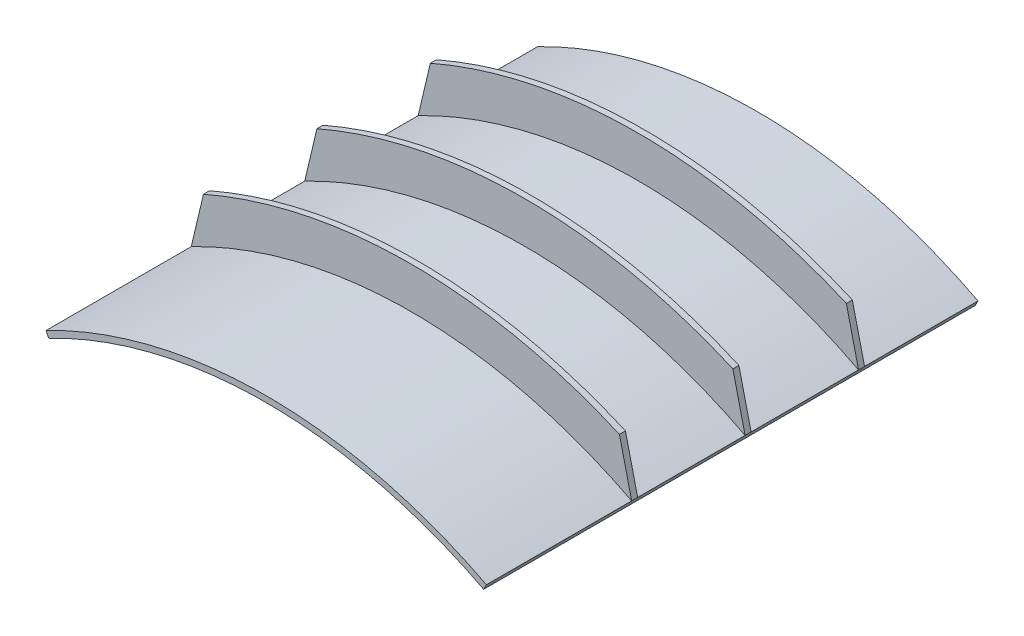
ISO-10303-21;
HEADER;
FILE_DESCRIPTION(('STEP AP214'),'2;1');
FILE_NAME('part.step','',(''),(''),'','','');
FILE_SCHEMA(('AUTOMOTIVE_DESIGN { 1 0 10303 214 1 1 1 1 }'));
ENDSEC;
DATA;
#1=APPLICATION_CONTEXT('core data for automotive mechanical design processes');
#2=APPLICATION_PROTOCOL_DEFINITION('international standard','automotive_design',2000,#1);
#3=PRODUCT_CONTEXT('',#1,'mechanical');
#4=PRODUCT('Part','Part','',(#3));
#5=PRODUCT_RELATED_PRODUCT_CATEGORY('part','',(#4));
#6=PRODUCT_DEFINITION_FORMATION('','',#4);
#7=PRODUCT_DEFINITION_CONTEXT('part definition',#1,'design');
#8=PRODUCT_DEFINITION('design','',#6,#7);
#9=PRODUCT_DEFINITION_SHAPE('','',#8);
#10=(LENGTH_UNIT() NAMED_UNIT(*) SI_UNIT(.MILLI.,.METRE.));
#11=(NAMED_UNIT(*) PLANE_ANGLE_UNIT() SI_UNIT($,.RADIAN.));
#12=(NAMED_UNIT(*) SI_UNIT($,.STERADIAN.) SOLID_ANGLE_UNIT());
#13=UNCERTAINTY_MEASURE_WITH_UNIT(LENGTH_MEASURE(1.E-05),#10,'distance_accuracy_value','');
#14=(GEOMETRIC_REPRESENTATION_CONTEXT(3) GLOBAL_UNCERTAINTY_ASSIGNED_CONTEXT((#13)) GLOBAL_UNIT_ASSIGNED_CONTEXT((#10,
#11,#12)) REPRESENTATION_CONTEXT('',''));
#15=CARTESIAN_POINT('',(0.,0.,0.));
#16=DIRECTION('',(0.,0.,1.));
#17=DIRECTION('',(1.,0.,0.));
#18=AXIS2_PLACEMENT_3D('',#15,#16,#17);
#19=CARTESIAN_POINT('',(0.,0.,260.));
#20=DIRECTION('',(0.,0.,-1.));
#21=DIRECTION('',(-1.,0.,0.));
#22=AXIS2_PLACEMENT_3D('',#19,#20,#21);
#23=CYLINDRICAL_SURFACE('',#22,253.175);
#24=CARTESIAN_POINT('',(0.,0.,183.175));
#25=DIRECTION('',(0.,0.,-1.));
#26=DIRECTION('',(-1.,0.,0.));
#27=AXIS2_PLACEMENT_3D('',#24,#25,#26);
#28=CIRCLE('',#27,253.175);
#29=CARTESIAN_POINT('',(-116.4605,224.798871360045,183.175));
#30=VERTEX_POINT('',#29);
#31=CARTESIAN_POINT('',(116.4605,224.798871360045,183.175));
#32=VERTEX_POINT('',#31);
#33=EDGE_CURVE('E56',#30,#32,#28,.T.);
#34=ORIENTED_EDGE('',*,*,#33,.F.);
#35=DIRECTION('',(0.,0.,-1.));
#36=VECTOR('',#35,1.);
#37=CARTESIAN_POINT('',(-116.4605,224.798871360045,260.));
#38=LINE('',#37,#36);
#39=CARTESIAN_POINT('',(-116.4605,224.798871360045,260.));
#40=VERTEX_POINT('',#39);
#41=EDGE_CURVE('E11',#40,#30,#38,.T.);
#42=ORIENTED_EDGE('',*,*,#41,.F.);
#43=CARTESIAN_POINT('',(0.,0.,260.));
#44=DIRECTION('',(0.,0.,1.));
#45=DIRECTION('',(-1.,0.,0.));
#46=AXIS2_PLACEMENT_3D('',#43,#44,#45);
#47=CIRCLE('',#46,253.175);
#48=CARTESIAN_POINT('',(116.4605,224.798871360045,260.));
#49=VERTEX_POINT('',#48);
#50=EDGE_CURVE('E252',#49,#40,#47,.T.);
#51=ORIENTED_EDGE('',*,*,#50,.F.);
#52=DIRECTION('',(0.,0.,-1.));
#53=VECTOR('',#52,1.);
#54=CARTESIAN_POINT('',(116.4605,224.798871360045,260.));
#55=LINE('',#54,#53);
#56=EDGE_CURVE('E271',#49,#32,#55,.T.);
#57=ORIENTED_EDGE('',*,*,#56,.T.);
#58=EDGE_LOOP('',(#34,#42,#51,#57));
#59=FACE_BOUND('',#58,.T.);
#60=ADVANCED_FACE('F33',(#59),#23,.T.);
#61=CARTESIAN_POINT('',(-116.4605,224.798871360045,180.));
#62=VERTEX_POINT('',#61);
#63=CARTESIAN_POINT('',(-116.4605,224.798871360045,123.175));
#64=VERTEX_POINT('',#63);
#65=EDGE_CURVE('E41',#62,#64,#38,.T.);
#66=ORIENTED_EDGE('',*,*,#65,.F.);
#67=CARTESIAN_POINT('',(0.,0.,180.));
#68=DIRECTION('',(0.,0.,-1.));
#69=DIRECTION('',(-1.,0.,0.));
#70=AXIS2_PLACEMENT_3D('',#67,#68,#69);
#71=CIRCLE('',#70,253.175);
#72=CARTESIAN_POINT('',(116.4605,224.798871360045,180.));
#73=VERTEX_POINT('',#72);
#74=EDGE_CURVE('E176',#62,#73,#71,.T.);
#75=ORIENTED_EDGE('',*,*,#74,.T.);
#76=CARTESIAN_POINT('',(116.4605,224.798871360045,123.175));
#77=VERTEX_POINT('',#76);
#78=EDGE_CURVE('E274',#73,#77,#55,.T.);
#79=ORIENTED_EDGE('',*,*,#78,.T.);
#80=CARTESIAN_POINT('',(0.,0.,123.175));
#81=DIRECTION('',(0.,0.,-1.));
#82=DIRECTION('',(-1.,0.,0.));
#83=AXIS2_PLACEMENT_3D('',#80,#81,#82);
#84=CIRCLE('',#83,253.175);
#85=EDGE_CURVE('E188',#64,#77,#84,.T.);
#86=ORIENTED_EDGE('',*,*,#85,.F.);
#87=EDGE_LOOP('',(#66,#75,#79,#86));
#88=FACE_BOUND('',#87,.T.);
#89=ADVANCED_FACE('F289',(#88),#23,.T.);
#90=CARTESIAN_POINT('',(-116.4605,224.798871360045,120.));
#91=VERTEX_POINT('',#90);
#92=CARTESIAN_POINT('',(-116.4605,224.798871360045,63.175));
#93=VERTEX_POINT('',#92);
#94=EDGE_CURVE('E282',#91,#93,#38,.T.);
#95=ORIENTED_EDGE('',*,*,#94,.F.);
#96=CARTESIAN_POINT('',(0.,0.,120.));
#97=DIRECTION('',(0.,0.,-1.));
#98=DIRECTION('',(-1.,0.,0.));
#99=AXIS2_PLACEMENT_3D('',#96,#97,#98);
#100=CIRCLE('',#99,253.175);
#101=CARTESIAN_POINT('',(116.4605,224.798871360045,120.));
#102=VERTEX_POINT('',#101);
#103=EDGE_CURVE('E187',#91,#102,#100,.T.);
#104=ORIENTED_EDGE('',*,*,#103,.T.);
#105=CARTESIAN_POINT('',(116.4605,224.798871360045,63.175));
#106=VERTEX_POINT('',#105);
#107=EDGE_CURVE('E306',#102,#106,#55,.T.);
#108=ORIENTED_EDGE('',*,*,#107,.T.);
#109=CARTESIAN_POINT('',(0.,0.,63.175));
#110=DIRECTION('',(0.,0.,-1.));
#111=DIRECTION('',(-1.,0.,0.));
#112=AXIS2_PLACEMENT_3D('',#109,#110,#111);
#113=CIRCLE('',#112,253.175);
#114=EDGE_CURVE('E220',#93,#106,#113,.T.);
#115=ORIENTED_EDGE('',*,*,#114,.F.);
#116=EDGE_LOOP('',(#95,#104,#108,#115));
#117=FACE_BOUND('',#116,.T.);
#118=ADVANCED_FACE('F305',(#117),#23,.T.);
#119=CARTESIAN_POINT('',(-116.4605,224.798871360045,60.));
#120=VERTEX_POINT('',#119);
#121=CARTESIAN_POINT('',(-116.4605,224.798871360045,0.));
#122=VERTEX_POINT('',#121);
#123=EDGE_CURVE('E42',#120,#122,#38,.T.);
#124=ORIENTED_EDGE('',*,*,#123,.F.);
#125=CARTESIAN_POINT('',(0.,0.,60.));
#126=DIRECTION('',(0.,0.,-1.));
#127=DIRECTION('',(-1.,0.,0.));
#128=AXIS2_PLACEMENT_3D('',#125,#126,#127);
#129=CIRCLE('',#128,253.175);
#130=CARTESIAN_POINT('',(116.4605,224.798871360045,60.));
#131=VERTEX_POINT('',#130);
#132=EDGE_CURVE('E219',#120,#131,#129,.T.);
#133=ORIENTED_EDGE('',*,*,#132,.T.);
#134=CARTESIAN_POINT('',(116.4605,224.798871360045,0.));
#135=VERTEX_POINT('',#134);
#136=EDGE_CURVE('E262',#131,#135,#55,.T.);
#137=ORIENTED_EDGE('',*,*,#136,.T.);
#138=CARTESIAN_POINT('',(0.,0.,0.));
#139=DIRECTION('',(0.,0.,1.));
#140=DIRECTION('',(-1.,0.,0.));
#141=AXIS2_PLACEMENT_3D('',#138,#139,#140);
#142=CIRCLE('',#141,253.175);
#143=EDGE_CURVE('E251',#135,#122,#142,.T.);
#144=ORIENTED_EDGE('',*,*,#143,.T.);
#145=EDGE_LOOP('',(#124,#133,#137,#144));
#146=FACE_BOUND('',#145,.T.);
#147=ADVANCED_FACE('F35',(#146),#23,.T.);
#148=CARTESIAN_POINT('',(-116.4605,224.798871360045,260.));
#149=DIRECTION('',(0.887918915216923,0.460000000000002,0.));
#150=DIRECTION('',(-0.460000000000002,0.887918915216924,0.));
#151=AXIS2_PLACEMENT_3D('',#148,#149,#150);
#152=PLANE('',#151);
#153=DIRECTION('',(0.460000000000002,-0.887918915216923,0.));
#154=VECTOR('',#153,1.);
#155=CARTESIAN_POINT('',(-116.4605,224.798871360045,0.));
#156=LINE('',#155,#154);
#157=CARTESIAN_POINT('',(-115.,221.979728804231,0.));
#158=VERTEX_POINT('',#157);
#159=EDGE_CURVE('E265',#122,#158,#156,.T.);
#160=ORIENTED_EDGE('',*,*,#159,.T.);
#161=DIRECTION('',(0.,0.,-1.));
#162=VECTOR('',#161,1.);
#163=CARTESIAN_POINT('',(-115.,221.979728804231,260.));
#164=LINE('',#163,#162);
#165=CARTESIAN_POINT('',(-115.,221.979728804231,260.));
#166=VERTEX_POINT('',#165);
#167=EDGE_CURVE('E276',#166,#158,#164,.T.);
#168=ORIENTED_EDGE('',*,*,#167,.F.);
#169=DIRECTION('',(0.460000000000002,-0.887918915216923,0.));
#170=VECTOR('',#169,1.);
#171=CARTESIAN_POINT('',(-116.4605,224.798871360045,260.));
#172=LINE('',#171,#170);
#173=EDGE_CURVE('E255',#40,#166,#172,.T.);
#174=ORIENTED_EDGE('',*,*,#173,.F.);
#175=ORIENTED_EDGE('',*,*,#41,.T.);
#176=DIRECTION('',(0.,0.,-1.));
#177=VECTOR('',#176,1.);
#178=CARTESIAN_POINT('',(-116.4605,224.798871360045,183.175));
#179=LINE('',#178,#177);
#180=EDGE_CURVE('E172',#30,#62,#179,.T.);
#181=ORIENTED_EDGE('',*,*,#180,.T.);
#182=ORIENTED_EDGE('',*,*,#65,.T.);
#183=DIRECTION('',(0.,0.,-1.));
#184=VECTOR('',#183,1.);
#185=CARTESIAN_POINT('',(-116.4605,224.798871360045,123.175));
#186=LINE('',#185,#184);
#187=EDGE_CURVE('E199',#64,#91,#186,.T.);
#188=ORIENTED_EDGE('',*,*,#187,.T.);
#189=ORIENTED_EDGE('',*,*,#94,.T.);
#190=DIRECTION('',(0.,0.,-1.));
#191=VECTOR('',#190,1.);
#192=CARTESIAN_POINT('',(-116.4605,224.798871360045,63.175));
#193=LINE('',#192,#191);
#194=EDGE_CURVE('E231',#93,#120,#193,.T.);
#195=ORIENTED_EDGE('',*,*,#194,.T.);
#196=ORIENTED_EDGE('',*,*,#123,.T.);
#197=EDGE_LOOP('',(#160,#168,#174,#175,#181,#182,#188,#189,#195,#196));
#198=FACE_BOUND('',#197,.T.);
#199=ADVANCED_FACE('F286',(#198),#152,.F.);
#200=CARTESIAN_POINT('',(0.,0.,260.));
#201=DIRECTION('',(0.,0.,-1.));
#202=DIRECTION('',(-1.,0.,0.));
#203=AXIS2_PLACEMENT_3D('',#200,#201,#202);
#204=CYLINDRICAL_SURFACE('',#203,250.);
#205=CARTESIAN_POINT('',(0.,0.,0.));
#206=DIRECTION('',(0.,0.,-1.));
#207=DIRECTION('',(-1.,0.,0.));
#208=AXIS2_PLACEMENT_3D('',#205,#206,#207);
#209=CIRCLE('',#208,250.);
#210=CARTESIAN_POINT('',(115.,221.979728804231,0.));
#211=VERTEX_POINT('',#210);
#212=EDGE_CURVE('E267',#158,#211,#209,.T.);
#213=ORIENTED_EDGE('',*,*,#212,.T.);
#214=DIRECTION('',(0.,0.,-1.));
#215=VECTOR('',#214,1.);
#216=CARTESIAN_POINT('',(115.,221.979728804231,260.));
#217=LINE('',#216,#215);
#218=CARTESIAN_POINT('',(115.,221.979728804231,260.));
#219=VERTEX_POINT('',#218);
#220=EDGE_CURVE('E273',#219,#211,#217,.T.);
#221=ORIENTED_EDGE('',*,*,#220,.F.);
#222=CARTESIAN_POINT('',(0.,0.,260.));
#223=DIRECTION('',(0.,0.,-1.));
#224=DIRECTION('',(-1.,0.,0.));
#225=AXIS2_PLACEMENT_3D('',#222,#223,#224);
#226=CIRCLE('',#225,250.);
#227=EDGE_CURVE('E258',#166,#219,#226,.T.);
#228=ORIENTED_EDGE('',*,*,#227,.F.);
#229=ORIENTED_EDGE('',*,*,#167,.T.);
#230=EDGE_LOOP('',(#213,#221,#228,#229));
#231=FACE_BOUND('',#230,.T.);
#232=ADVANCED_FACE('F328',(#231),#204,.F.);
#233=CARTESIAN_POINT('',(115.,221.979728804231,260.));
#234=DIRECTION('',(-0.887918915216925,0.459999999999999,0.));
#235=DIRECTION('',(-0.459999999999999,-0.887918915216925,0.));
#236=AXIS2_PLACEMENT_3D('',#233,#234,#235);
#237=PLANE('',#236);
#238=DIRECTION('',(0.459999999999999,0.887918915216925,0.));
#239=VECTOR('',#238,1.);
#240=CARTESIAN_POINT('',(115.,221.979728804231,0.));
#241=LINE('',#240,#239);
#242=EDGE_CURVE('E256',#211,#135,#241,.T.);
#243=ORIENTED_EDGE('',*,*,#242,.T.);
#244=ORIENTED_EDGE('',*,*,#136,.F.);
#245=DIRECTION('',(0.,0.,-1.));
#246=VECTOR('',#245,1.);
#247=CARTESIAN_POINT('',(116.4605,224.798871360045,63.175));
#248=LINE('',#247,#246);
#249=EDGE_CURVE('E248',#106,#131,#248,.T.);
#250=ORIENTED_EDGE('',*,*,#249,.F.);
#251=ORIENTED_EDGE('',*,*,#107,.F.);
#252=DIRECTION('',(0.,0.,-1.));
#253=VECTOR('',#252,1.);
#254=CARTESIAN_POINT('',(116.4605,224.798871360045,123.175));
#255=LINE('',#254,#253);
#256=EDGE_CURVE('E216',#77,#102,#255,.T.);
#257=ORIENTED_EDGE('',*,*,#256,.F.);
#258=ORIENTED_EDGE('',*,*,#78,.F.);
#259=DIRECTION('',(0.,0.,-1.));
#260=VECTOR('',#259,1.);
#261=CARTESIAN_POINT('',(116.4605,224.798871360045,183.175));
#262=LINE('',#261,#260);
#263=EDGE_CURVE('E164',#32,#73,#262,.T.);
#264=ORIENTED_EDGE('',*,*,#263,.F.);
#265=ORIENTED_EDGE('',*,*,#56,.F.);
#266=DIRECTION('',(0.459999999999999,0.887918915216925,0.));
#267=VECTOR('',#266,1.);
#268=CARTESIAN_POINT('',(115.,221.979728804231,260.));
#269=LINE('',#268,#267);
#270=EDGE_CURVE('E260',#219,#49,#269,.T.);
#271=ORIENTED_EDGE('',*,*,#270,.F.);
#272=ORIENTED_EDGE('',*,*,#220,.T.);
#273=EDGE_LOOP('',(#243,#244,#250,#251,#257,#258,#264,#265,#271,#272));
#274=FACE_BOUND('',#273,.T.);
#275=ADVANCED_FACE('F341',(#274),#237,.F.);
#276=CARTESIAN_POINT('',(0.,0.,260.));
#277=DIRECTION('',(0.,0.,-1.));
#278=DIRECTION('',(-1.,0.,0.));
#279=AXIS2_PLACEMENT_3D('',#276,#277,#278);
#280=PLANE('',#279);
#281=ORIENTED_EDGE('',*,*,#50,.T.);
#282=ORIENTED_EDGE('',*,*,#173,.T.);
#283=ORIENTED_EDGE('',*,*,#227,.T.);
#284=ORIENTED_EDGE('',*,*,#270,.T.);
#285=EDGE_LOOP('',(#281,#282,#283,#284));
#286=FACE_BOUND('',#285,.T.);
#287=ADVANCED_FACE('F331',(#286),#280,.F.);
#288=CARTESIAN_POINT('',(0.,0.,0.));
#289=DIRECTION('',(0.,0.,-1.));
#290=DIRECTION('',(-1.,0.,0.));
#291=AXIS2_PLACEMENT_3D('',#288,#289,#290);
#292=PLANE('',#291);
#293=ORIENTED_EDGE('',*,*,#143,.F.);
#294=ORIENTED_EDGE('',*,*,#242,.F.);
#295=ORIENTED_EDGE('',*,*,#212,.F.);
#296=ORIENTED_EDGE('',*,*,#159,.F.);
#297=EDGE_LOOP('',(#293,#294,#295,#296));
#298=FACE_BOUND('',#297,.T.);
#299=ADVANCED_FACE('F326',(#298),#292,.T.);
#300=CARTESIAN_POINT('',(116.4605,224.798871360045,63.175));
#301=DIRECTION('',(-0.973014087551454,-0.230745715943787,0.));
#302=DIRECTION('',(0.230745715943787,-0.973014087551455,0.));
#303=AXIS2_PLACEMENT_3D('',#300,#301,#302);
#304=PLANE('',#303);
#305=DIRECTION('',(-0.230745715943787,0.973014087551454,0.));
#306=VECTOR('',#305,1.);
#307=CARTESIAN_POINT('',(116.4605,224.798871360045,60.));
#308=LINE('',#307,#306);
#309=CARTESIAN_POINT('',(110.,252.041663222571,60.));
#310=VERTEX_POINT('',#309);
#311=EDGE_CURVE('E234',#131,#310,#308,.T.);
#312=ORIENTED_EDGE('',*,*,#311,.T.);
#313=DIRECTION('',(0.,0.,-1.));
#314=VECTOR('',#313,1.);
#315=CARTESIAN_POINT('',(110.,252.041663222571,63.175));
#316=LINE('',#315,#314);
#317=CARTESIAN_POINT('',(110.,252.041663222571,63.175));
#318=VERTEX_POINT('',#317);
#319=EDGE_CURVE('E245',#318,#310,#316,.T.);
#320=ORIENTED_EDGE('',*,*,#319,.F.);
#321=DIRECTION('',(-0.230745715943787,0.973014087551454,0.));
#322=VECTOR('',#321,1.);
#323=CARTESIAN_POINT('',(116.4605,224.798871360045,63.175));
#324=LINE('',#323,#322);
#325=EDGE_CURVE('E223',#106,#318,#324,.T.);
#326=ORIENTED_EDGE('',*,*,#325,.F.);
#327=ORIENTED_EDGE('',*,*,#249,.T.);
#328=EDGE_LOOP('',(#312,#320,#326,#327));
#329=FACE_BOUND('',#328,.T.);
#330=ADVANCED_FACE('F411',(#329),#304,.F.);
#331=CARTESIAN_POINT('',(0.,0.,63.175));
#332=DIRECTION('',(0.,0.,-1.));
#333=DIRECTION('',(-1.,0.,0.));
#334=AXIS2_PLACEMENT_3D('',#331,#332,#333);
#335=CYLINDRICAL_SURFACE('',#334,275.);
#336=CARTESIAN_POINT('',(0.,0.,60.));
#337=DIRECTION('',(0.,0.,1.));
#338=DIRECTION('',(-1.,0.,0.));
#339=AXIS2_PLACEMENT_3D('',#336,#337,#338);
#340=CIRCLE('',#339,275.);
#341=CARTESIAN_POINT('',(-110.,252.041663222571,60.));
#342=VERTEX_POINT('',#341);
#343=EDGE_CURVE('E236',#310,#342,#340,.T.);
#344=ORIENTED_EDGE('',*,*,#343,.T.);
#345=DIRECTION('',(0.,0.,-1.));
#346=VECTOR('',#345,1.);
#347=CARTESIAN_POINT('',(-110.,252.041663222571,63.175));
#348=LINE('',#347,#346);
#349=CARTESIAN_POINT('',(-110.,252.041663222571,63.175));
#350=VERTEX_POINT('',#349);
#351=EDGE_CURVE('E242',#350,#342,#348,.T.);
#352=ORIENTED_EDGE('',*,*,#351,.F.);
#353=CARTESIAN_POINT('',(0.,0.,63.175));
#354=DIRECTION('',(0.,0.,1.));
#355=DIRECTION('',(-1.,0.,0.));
#356=AXIS2_PLACEMENT_3D('',#353,#354,#355);
#357=CIRCLE('',#356,275.);
#358=EDGE_CURVE('E226',#318,#350,#357,.T.);
#359=ORIENTED_EDGE('',*,*,#358,.F.);
#360=ORIENTED_EDGE('',*,*,#319,.T.);
#361=EDGE_LOOP('',(#344,#352,#359,#360));
#362=FACE_BOUND('',#361,.T.);
#363=ADVANCED_FACE('F402',(#362),#335,.T.);
#364=CARTESIAN_POINT('',(-110.,252.041663222571,63.175));
#365=DIRECTION('',(0.973014087551454,-0.230745715943786,0.));
#366=DIRECTION('',(0.230745715943786,0.973014087551455,0.));
#367=AXIS2_PLACEMENT_3D('',#364,#365,#366);
#368=PLANE('',#367);
#369=DIRECTION('',(-0.230745715943786,-0.973014087551455,0.));
#370=VECTOR('',#369,1.);
#371=CARTESIAN_POINT('',(-110.,252.041663222571,60.));
#372=LINE('',#371,#370);
#373=EDGE_CURVE('E224',#342,#120,#372,.T.);
#374=ORIENTED_EDGE('',*,*,#373,.T.);
#375=ORIENTED_EDGE('',*,*,#194,.F.);
#376=DIRECTION('',(-0.230745715943786,-0.973014087551455,0.));
#377=VECTOR('',#376,1.);
#378=CARTESIAN_POINT('',(-110.,252.041663222571,63.175));
#379=LINE('',#378,#377);
#380=EDGE_CURVE('E228',#350,#93,#379,.T.);
#381=ORIENTED_EDGE('',*,*,#380,.F.);
#382=ORIENTED_EDGE('',*,*,#351,.T.);
#383=EDGE_LOOP('',(#374,#375,#381,#382));
#384=FACE_BOUND('',#383,.T.);
#385=ADVANCED_FACE('F315',(#384),#368,.F.);
#386=CARTESIAN_POINT('',(0.,0.,63.175));
#387=DIRECTION('',(0.,0.,-1.));
#388=DIRECTION('',(-1.,0.,0.));
#389=AXIS2_PLACEMENT_3D('',#386,#387,#388);
#390=PLANE('',#389);
#391=ORIENTED_EDGE('',*,*,#114,.T.);
#392=ORIENTED_EDGE('',*,*,#325,.T.);
#393=ORIENTED_EDGE('',*,*,#358,.T.);
#394=ORIENTED_EDGE('',*,*,#380,.T.);
#395=EDGE_LOOP('',(#391,#392,#393,#394));
#396=FACE_BOUND('',#395,.T.);
#397=ADVANCED_FACE('F311',(#396),#390,.F.);
#398=CARTESIAN_POINT('',(0.,0.,60.));
#399=DIRECTION('',(0.,0.,-1.));
#400=DIRECTION('',(-1.,0.,0.));
#401=AXIS2_PLACEMENT_3D('',#398,#399,#400);
#402=PLANE('',#401);
#403=ORIENTED_EDGE('',*,*,#132,.F.);
#404=ORIENTED_EDGE('',*,*,#373,.F.);
#405=ORIENTED_EDGE('',*,*,#343,.F.);
#406=ORIENTED_EDGE('',*,*,#311,.F.);
#407=EDGE_LOOP('',(#403,#404,#405,#406));
#408=FACE_BOUND('',#407,.T.);
#409=ADVANCED_FACE('F321',(#408),#402,.T.);
#410=CARTESIAN_POINT('',(116.4605,224.798871360045,123.175));
#411=DIRECTION('',(-0.973014087551454,-0.230745715943787,0.));
#412=DIRECTION('',(0.230745715943787,-0.973014087551455,0.));
#413=AXIS2_PLACEMENT_3D('',#410,#411,#412);
#414=PLANE('',#413);
#415=DIRECTION('',(-0.230745715943787,0.973014087551454,0.));
#416=VECTOR('',#415,1.);
#417=CARTESIAN_POINT('',(116.4605,224.798871360045,120.));
#418=LINE('',#417,#416);
#419=CARTESIAN_POINT('',(110.,252.041663222571,120.));
#420=VERTEX_POINT('',#419);
#421=EDGE_CURVE('E202',#102,#420,#418,.T.);
#422=ORIENTED_EDGE('',*,*,#421,.T.);
#423=DIRECTION('',(0.,0.,-1.));
#424=VECTOR('',#423,1.);
#425=CARTESIAN_POINT('',(110.,252.041663222571,123.175));
#426=LINE('',#425,#424);
#427=CARTESIAN_POINT('',(110.,252.041663222571,123.175));
#428=VERTEX_POINT('',#427);
#429=EDGE_CURVE('E213',#428,#420,#426,.T.);
#430=ORIENTED_EDGE('',*,*,#429,.F.);
#431=DIRECTION('',(-0.230745715943787,0.973014087551454,0.));
#432=VECTOR('',#431,1.);
#433=CARTESIAN_POINT('',(116.4605,224.798871360045,123.175));
#434=LINE('',#433,#432);
#435=EDGE_CURVE('E191',#77,#428,#434,.T.);
#436=ORIENTED_EDGE('',*,*,#435,.F.);
#437=ORIENTED_EDGE('',*,*,#256,.T.);
#438=EDGE_LOOP('',(#422,#430,#436,#437));
#439=FACE_BOUND('',#438,.T.);
#440=ADVANCED_FACE('F345',(#439),#414,.F.);
#441=CARTESIAN_POINT('',(0.,0.,123.175));
#442=DIRECTION('',(0.,0.,-1.));
#443=DIRECTION('',(-1.,0.,0.));
#444=AXIS2_PLACEMENT_3D('',#441,#442,#443);
#445=CYLINDRICAL_SURFACE('',#444,275.);
#446=CARTESIAN_POINT('',(0.,0.,120.));
#447=DIRECTION('',(0.,0.,1.));
#448=DIRECTION('',(-1.,0.,0.));
#449=AXIS2_PLACEMENT_3D('',#446,#447,#448);
#450=CIRCLE('',#449,275.);
#451=CARTESIAN_POINT('',(-110.,252.041663222571,120.));
#452=VERTEX_POINT('',#451);
#453=EDGE_CURVE('E204',#420,#452,#450,.T.);
#454=ORIENTED_EDGE('',*,*,#453,.T.);
#455=DIRECTION('',(0.,0.,-1.));
#456=VECTOR('',#455,1.);
#457=CARTESIAN_POINT('',(-110.,252.041663222571,123.175));
#458=LINE('',#457,#456);
#459=CARTESIAN_POINT('',(-110.,252.041663222571,123.175));
#460=VERTEX_POINT('',#459);
#461=EDGE_CURVE('E210',#460,#452,#458,.T.);
#462=ORIENTED_EDGE('',*,*,#461,.F.);
#463=CARTESIAN_POINT('',(0.,0.,123.175));
#464=DIRECTION('',(0.,0.,1.));
#465=DIRECTION('',(-1.,0.,0.));
#466=AXIS2_PLACEMENT_3D('',#463,#464,#465);
#467=CIRCLE('',#466,275.);
#468=EDGE_CURVE('E194',#428,#460,#467,.T.);
#469=ORIENTED_EDGE('',*,*,#468,.F.);
#470=ORIENTED_EDGE('',*,*,#429,.T.);
#471=EDGE_LOOP('',(#454,#462,#469,#470));
#472=FACE_BOUND('',#471,.T.);
#473=ADVANCED_FACE('F347',(#472),#445,.T.);
#474=CARTESIAN_POINT('',(-110.,252.041663222571,123.175));
#475=DIRECTION('',(0.973014087551454,-0.230745715943786,0.));
#476=DIRECTION('',(0.230745715943786,0.973014087551455,0.));
#477=AXIS2_PLACEMENT_3D('',#474,#475,#476);
#478=PLANE('',#477);
#479=DIRECTION('',(-0.230745715943786,-0.973014087551455,0.));
#480=VECTOR('',#479,1.);
#481=CARTESIAN_POINT('',(-110.,252.041663222571,120.));
#482=LINE('',#481,#480);
#483=EDGE_CURVE('E192',#452,#91,#482,.T.);
#484=ORIENTED_EDGE('',*,*,#483,.T.);
#485=ORIENTED_EDGE('',*,*,#187,.F.);
#486=DIRECTION('',(-0.230745715943786,-0.973014087551455,0.));
#487=VECTOR('',#486,1.);
#488=CARTESIAN_POINT('',(-110.,252.041663222571,123.175));
#489=LINE('',#488,#487);
#490=EDGE_CURVE('E196',#460,#64,#489,.T.);
#491=ORIENTED_EDGE('',*,*,#490,.F.);
#492=ORIENTED_EDGE('',*,*,#461,.T.);
#493=EDGE_LOOP('',(#484,#485,#491,#492));
#494=FACE_BOUND('',#493,.T.);
#495=ADVANCED_FACE('F297',(#494),#478,.F.);
#496=CARTESIAN_POINT('',(0.,0.,123.175));
#497=DIRECTION('',(0.,0.,-1.));
#498=DIRECTION('',(-1.,0.,0.));
#499=AXIS2_PLACEMENT_3D('',#496,#497,#498);
#500=PLANE('',#499);
#501=ORIENTED_EDGE('',*,*,#85,.T.);
#502=ORIENTED_EDGE('',*,*,#435,.T.);
#503=ORIENTED_EDGE('',*,*,#468,.T.);
#504=ORIENTED_EDGE('',*,*,#490,.T.);
#505=EDGE_LOOP('',(#501,#502,#503,#504));
#506=FACE_BOUND('',#505,.T.);
#507=ADVANCED_FACE('F293',(#506),#500,.F.);
#508=CARTESIAN_POINT('',(0.,0.,120.));
#509=DIRECTION('',(0.,0.,-1.));
#510=DIRECTION('',(-1.,0.,0.));
#511=AXIS2_PLACEMENT_3D('',#508,#509,#510);
#512=PLANE('',#511);
#513=ORIENTED_EDGE('',*,*,#103,.F.);
#514=ORIENTED_EDGE('',*,*,#483,.F.);
#515=ORIENTED_EDGE('',*,*,#453,.F.);
#516=ORIENTED_EDGE('',*,*,#421,.F.);
#517=EDGE_LOOP('',(#513,#514,#515,#516));
#518=FACE_BOUND('',#517,.T.);
#519=ADVANCED_FACE('F303',(#518),#512,.T.);
#520=CARTESIAN_POINT('',(116.4605,224.798871360045,183.175));
#521=DIRECTION('',(-0.973014087551454,-0.230745715943787,0.));
#522=DIRECTION('',(0.230745715943787,-0.973014087551455,0.));
#523=AXIS2_PLACEMENT_3D('',#520,#521,#522);
#524=PLANE('',#523);
#525=DIRECTION('',(-0.230745715943787,0.973014087551454,0.));
#526=VECTOR('',#525,1.);
#527=CARTESIAN_POINT('',(116.4605,224.798871360045,180.));
#528=LINE('',#527,#526);
#529=CARTESIAN_POINT('',(110.,252.041663222571,180.));
#530=VERTEX_POINT('',#529);
#531=EDGE_CURVE('E161',#73,#530,#528,.T.);
#532=ORIENTED_EDGE('',*,*,#531,.T.);
#533=DIRECTION('',(0.,0.,-1.));
#534=VECTOR('',#533,1.);
#535=CARTESIAN_POINT('',(110.,252.041663222571,183.175));
#536=LINE('',#535,#534);
#537=CARTESIAN_POINT('',(110.,252.041663222571,183.175));
#538=VERTEX_POINT('',#537);
#539=EDGE_CURVE('E158',#538,#530,#536,.T.);
#540=ORIENTED_EDGE('',*,*,#539,.F.);
#541=DIRECTION('',(-0.230745715943787,0.973014087551454,0.));
#542=VECTOR('',#541,1.);
#543=CARTESIAN_POINT('',(116.4605,224.798871360045,183.175));
#544=LINE('',#543,#542);
#545=EDGE_CURVE('E147',#32,#538,#544,.T.);
#546=ORIENTED_EDGE('',*,*,#545,.F.);
#547=ORIENTED_EDGE('',*,*,#263,.T.);
#548=EDGE_LOOP('',(#532,#540,#546,#547));
#549=FACE_BOUND('',#548,.T.);
#550=ADVANCED_FACE('F159',(#549),#524,.F.);
#551=CARTESIAN_POINT('',(0.,0.,183.175));
#552=DIRECTION('',(0.,0.,-1.));
#553=DIRECTION('',(-1.,0.,0.));
#554=AXIS2_PLACEMENT_3D('',#551,#552,#553);
#555=CYLINDRICAL_SURFACE('',#554,275.);
#556=CARTESIAN_POINT('',(0.,0.,180.));
#557=DIRECTION('',(0.,0.,1.));
#558=DIRECTION('',(-1.,0.,0.));
#559=AXIS2_PLACEMENT_3D('',#556,#557,#558);
#560=CIRCLE('',#559,275.);
#561=CARTESIAN_POINT('',(-110.,252.041663222571,180.));
#562=VERTEX_POINT('',#561);
#563=EDGE_CURVE('E179',#530,#562,#560,.T.);
#564=ORIENTED_EDGE('',*,*,#563,.T.);
#565=DIRECTION('',(0.,0.,-1.));
#566=VECTOR('',#565,1.);
#567=CARTESIAN_POINT('',(-110.,252.041663222571,183.175));
#568=LINE('',#567,#566);
#569=CARTESIAN_POINT('',(-110.,252.041663222571,183.175));
#570=VERTEX_POINT('',#569);
#571=EDGE_CURVE('E165',#570,#562,#568,.T.);
#572=ORIENTED_EDGE('',*,*,#571,.F.);
#573=CARTESIAN_POINT('',(0.,0.,183.175));
#574=DIRECTION('',(0.,0.,1.));
#575=DIRECTION('',(-1.,0.,0.));
#576=AXIS2_PLACEMENT_3D('',#573,#574,#575);
#577=CIRCLE('',#576,275.);
#578=EDGE_CURVE('E152',#538,#570,#577,.T.);
#579=ORIENTED_EDGE('',*,*,#578,.F.);
#580=ORIENTED_EDGE('',*,*,#539,.T.);
#581=EDGE_LOOP('',(#564,#572,#579,#580));
#582=FACE_BOUND('',#581,.T.);
#583=ADVANCED_FACE('F167',(#582),#555,.T.);
#584=CARTESIAN_POINT('',(-110.,252.041663222571,183.175));
#585=DIRECTION('',(0.973014087551454,-0.230745715943786,0.));
#586=DIRECTION('',(0.230745715943786,0.973014087551455,0.));
#587=AXIS2_PLACEMENT_3D('',#584,#585,#586);
#588=PLANE('',#587);
#589=DIRECTION('',(-0.230745715943786,-0.973014087551455,0.));
#590=VECTOR('',#589,1.);
#591=CARTESIAN_POINT('',(-110.,252.041663222571,180.));
#592=LINE('',#591,#590);
#593=EDGE_CURVE('E181',#562,#62,#592,.T.);
#594=ORIENTED_EDGE('',*,*,#593,.T.);
#595=ORIENTED_EDGE('',*,*,#180,.F.);
#596=DIRECTION('',(-0.230745715943786,-0.973014087551455,0.));
#597=VECTOR('',#596,1.);
#598=CARTESIAN_POINT('',(-110.,252.041663222571,183.175));
#599=LINE('',#598,#597);
#600=EDGE_CURVE('E170',#570,#30,#599,.T.);
#601=ORIENTED_EDGE('',*,*,#600,.F.);
#602=ORIENTED_EDGE('',*,*,#571,.T.);
#603=EDGE_LOOP('',(#594,#595,#601,#602));
#604=FACE_BOUND('',#603,.T.);
#605=ADVANCED_FACE('F335',(#604),#588,.F.);
#606=CARTESIAN_POINT('',(0.,0.,183.175));
#607=DIRECTION('',(0.,0.,-1.));
#608=DIRECTION('',(-1.,0.,0.));
#609=AXIS2_PLACEMENT_3D('',#606,#607,#608);
#610=PLANE('',#609);
#611=ORIENTED_EDGE('',*,*,#33,.T.);
#612=ORIENTED_EDGE('',*,*,#545,.T.);
#613=ORIENTED_EDGE('',*,*,#578,.T.);
#614=ORIENTED_EDGE('',*,*,#600,.T.);
#615=EDGE_LOOP('',(#611,#612,#613,#614));
#616=FACE_BOUND('',#615,.T.);
#617=ADVANCED_FACE('F149',(#616),#610,.F.);
#618=CARTESIAN_POINT('',(0.,0.,180.));
#619=DIRECTION('',(0.,0.,-1.));
#620=DIRECTION('',(-1.,0.,0.));
#621=AXIS2_PLACEMENT_3D('',#618,#619,#620);
#622=PLANE('',#621);
#623=ORIENTED_EDGE('',*,*,#74,.F.);
#624=ORIENTED_EDGE('',*,*,#593,.F.);
#625=ORIENTED_EDGE('',*,*,#563,.F.);
#626=ORIENTED_EDGE('',*,*,#531,.F.);
#627=EDGE_LOOP('',(#623,#624,#625,#626));
#628=FACE_BOUND('',#627,.T.);
#629=ADVANCED_FACE('F339',(#628),#622,.T.);
#630=CLOSED_SHELL('',(#60,#89,#118,#147,#199,#232,#275,#287,#299,#330,#363,#385,#397,#409,#440,
#473,#495,#507,#519,#550,#583,#605,#617,#629));
#631=MANIFOLD_SOLID_BREP('B2',#630);
#632=ADVANCED_BREP_SHAPE_REPRESENTATION('',(#18,#631),#14);
#633=SHAPE_DEFINITION_REPRESENTATION(#9,#632);
ENDSEC;
END-ISO-10303-21;
